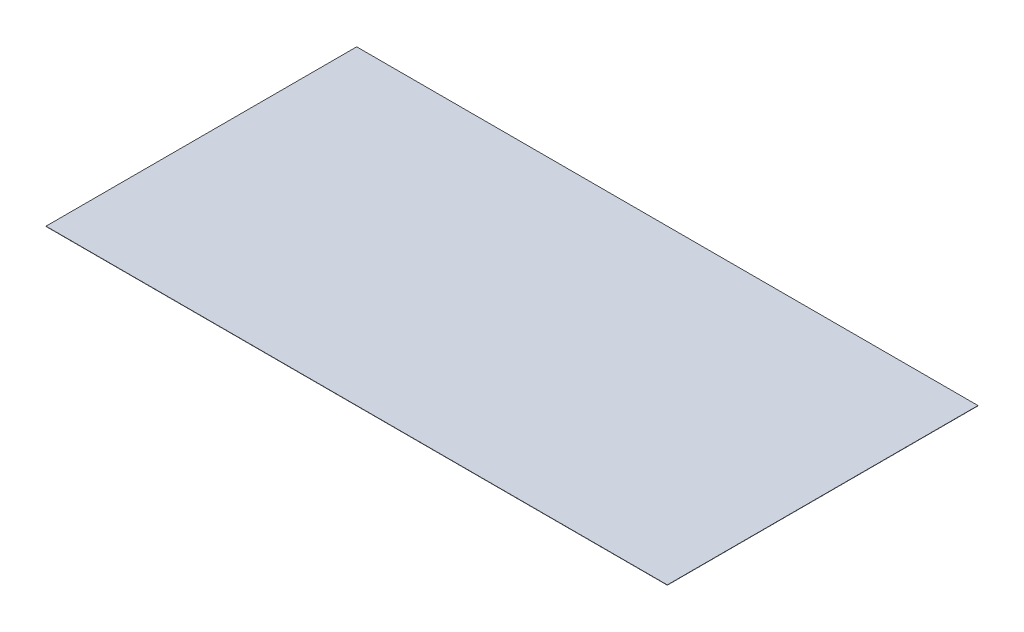
ISO-10303-21;
HEADER;
FILE_DESCRIPTION(('STEP AP214'),'2;1');
FILE_NAME('part.step','',(''),(''),'','','');
FILE_SCHEMA(('AUTOMOTIVE_DESIGN { 1 0 10303 214 1 1 1 1 }'));
ENDSEC;
DATA;
#1=APPLICATION_CONTEXT('core data for automotive mechanical design processes');
#2=APPLICATION_PROTOCOL_DEFINITION('international standard','automotive_design',2000,#1);
#3=PRODUCT_CONTEXT('',#1,'mechanical');
#4=PRODUCT('Part','Part','',(#3));
#5=PRODUCT_RELATED_PRODUCT_CATEGORY('part','',(#4));
#6=PRODUCT_DEFINITION_FORMATION('','',#4);
#7=PRODUCT_DEFINITION_CONTEXT('part definition',#1,'design');
#8=PRODUCT_DEFINITION('design','',#6,#7);
#9=PRODUCT_DEFINITION_SHAPE('','',#8);
#10=(LENGTH_UNIT() NAMED_UNIT(*) SI_UNIT(.MILLI.,.METRE.));
#11=(NAMED_UNIT(*) PLANE_ANGLE_UNIT() SI_UNIT($,.RADIAN.));
#12=(NAMED_UNIT(*) SI_UNIT($,.STERADIAN.) SOLID_ANGLE_UNIT());
#13=UNCERTAINTY_MEASURE_WITH_UNIT(LENGTH_MEASURE(1.E-05),#10,'distance_accuracy_value','');
#14=(GEOMETRIC_REPRESENTATION_CONTEXT(3) GLOBAL_UNCERTAINTY_ASSIGNED_CONTEXT((#13)) GLOBAL_UNIT_ASSIGNED_CONTEXT((#10,
#11,#12)) REPRESENTATION_CONTEXT('',''));
#15=CARTESIAN_POINT('',(0.,0.,0.));
#16=DIRECTION('',(0.,0.,1.));
#17=DIRECTION('',(1.,0.,0.));
#18=AXIS2_PLACEMENT_3D('',#15,#16,#17);
#19=CARTESIAN_POINT('',(0.,1.,0.));
#20=DIRECTION('',(1.,0.,0.));
#21=DIRECTION('',(0.,0.,-1.));
#22=AXIS2_PLACEMENT_3D('',#19,#20,#21);
#23=PLANE('',#22);
#24=DIRECTION('',(0.,0.,1.));
#25=VECTOR('',#24,1.);
#26=CARTESIAN_POINT('',(0.,0.,0.));
#27=LINE('',#26,#25);
#28=CARTESIAN_POINT('',(0.,0.,-1219.2));
#29=VERTEX_POINT('',#28);
#30=CARTESIAN_POINT('',(0.,0.,0.));
#31=VERTEX_POINT('',#30);
#32=EDGE_CURVE('E96',#29,#31,#27,.T.);
#33=ORIENTED_EDGE('',*,*,#32,.T.);
#34=DIRECTION('',(0.,-1.,0.));
#35=VECTOR('',#34,1.);
#36=CARTESIAN_POINT('',(0.,1.,0.));
#37=LINE('',#36,#35);
#38=CARTESIAN_POINT('',(0.,1.,0.));
#39=VERTEX_POINT('',#38);
#40=EDGE_CURVE('E11',#39,#31,#37,.T.);
#41=ORIENTED_EDGE('',*,*,#40,.F.);
#42=DIRECTION('',(0.,0.,1.));
#43=VECTOR('',#42,1.);
#44=CARTESIAN_POINT('',(0.,1.,0.));
#45=LINE('',#44,#43);
#46=CARTESIAN_POINT('',(0.,1.,-1219.2));
#47=VERTEX_POINT('',#46);
#48=EDGE_CURVE('E84',#47,#39,#45,.T.);
#49=ORIENTED_EDGE('',*,*,#48,.F.);
#50=DIRECTION('',(0.,-1.,0.));
#51=VECTOR('',#50,1.);
#52=CARTESIAN_POINT('',(0.,1.,-1219.2));
#53=LINE('',#52,#51);
#54=EDGE_CURVE('E92',#47,#29,#53,.T.);
#55=ORIENTED_EDGE('',*,*,#54,.T.);
#56=EDGE_LOOP('',(#33,#41,#49,#55));
#57=FACE_BOUND('',#56,.T.);
#58=ADVANCED_FACE('F33',(#57),#23,.F.);
#59=CARTESIAN_POINT('',(0.,1.,0.));
#60=DIRECTION('',(0.,0.,-1.));
#61=DIRECTION('',(-1.,0.,0.));
#62=AXIS2_PLACEMENT_3D('',#59,#60,#61);
#63=PLANE('',#62);
#64=DIRECTION('',(1.,0.,0.));
#65=VECTOR('',#64,1.);
#66=CARTESIAN_POINT('',(0.,0.,0.));
#67=LINE('',#66,#65);
#68=CARTESIAN_POINT('',(2438.4,0.,0.));
#69=VERTEX_POINT('',#68);
#70=EDGE_CURVE('E88',#31,#69,#67,.T.);
#71=ORIENTED_EDGE('',*,*,#70,.T.);
#72=DIRECTION('',(0.,-1.,0.));
#73=VECTOR('',#72,1.);
#74=CARTESIAN_POINT('',(2438.4,1.,0.));
#75=LINE('',#74,#73);
#76=CARTESIAN_POINT('',(2438.4,1.,0.));
#77=VERTEX_POINT('',#76);
#78=EDGE_CURVE('E41',#77,#69,#75,.T.);
#79=ORIENTED_EDGE('',*,*,#78,.F.);
#80=DIRECTION('',(1.,0.,0.));
#81=VECTOR('',#80,1.);
#82=CARTESIAN_POINT('',(0.,1.,0.));
#83=LINE('',#82,#81);
#84=EDGE_CURVE('E79',#39,#77,#83,.T.);
#85=ORIENTED_EDGE('',*,*,#84,.F.);
#86=ORIENTED_EDGE('',*,*,#40,.T.);
#87=EDGE_LOOP('',(#71,#79,#85,#86));
#88=FACE_BOUND('',#87,.T.);
#89=ADVANCED_FACE('F87',(#88),#63,.F.);
#90=CARTESIAN_POINT('',(2438.4,1.,0.));
#91=DIRECTION('',(-1.,0.,0.));
#92=DIRECTION('',(0.,0.,1.));
#93=AXIS2_PLACEMENT_3D('',#90,#91,#92);
#94=PLANE('',#93);
#95=DIRECTION('',(0.,0.,-1.));
#96=VECTOR('',#95,1.);
#97=CARTESIAN_POINT('',(2438.4,0.,0.));
#98=LINE('',#97,#96);
#99=CARTESIAN_POINT('',(2438.4,0.,-1219.2));
#100=VERTEX_POINT('',#99);
#101=EDGE_CURVE('E66',#69,#100,#98,.T.);
#102=ORIENTED_EDGE('',*,*,#101,.T.);
#103=DIRECTION('',(0.,-1.,0.));
#104=VECTOR('',#103,1.);
#105=CARTESIAN_POINT('',(2438.4,1.,-1219.2));
#106=LINE('',#105,#104);
#107=CARTESIAN_POINT('',(2438.4,1.,-1219.2));
#108=VERTEX_POINT('',#107);
#109=EDGE_CURVE('E89',#108,#100,#106,.T.);
#110=ORIENTED_EDGE('',*,*,#109,.F.);
#111=DIRECTION('',(0.,0.,-1.));
#112=VECTOR('',#111,1.);
#113=CARTESIAN_POINT('',(2438.4,1.,0.));
#114=LINE('',#113,#112);
#115=EDGE_CURVE('E82',#77,#108,#114,.T.);
#116=ORIENTED_EDGE('',*,*,#115,.F.);
#117=ORIENTED_EDGE('',*,*,#78,.T.);
#118=EDGE_LOOP('',(#102,#110,#116,#117));
#119=FACE_BOUND('',#118,.T.);
#120=ADVANCED_FACE('F90',(#119),#94,.F.);
#121=CARTESIAN_POINT('',(0.,1.,-1219.2));
#122=DIRECTION('',(0.,0.,1.));
#123=DIRECTION('',(1.,0.,0.));
#124=AXIS2_PLACEMENT_3D('',#121,#122,#123);
#125=PLANE('',#124);
#126=DIRECTION('',(-1.,0.,0.));
#127=VECTOR('',#126,1.);
#128=CARTESIAN_POINT('',(0.,0.,-1219.2));
#129=LINE('',#128,#127);
#130=EDGE_CURVE('E72',#100,#29,#129,.T.);
#131=ORIENTED_EDGE('',*,*,#130,.T.);
#132=ORIENTED_EDGE('',*,*,#54,.F.);
#133=DIRECTION('',(-1.,0.,0.));
#134=VECTOR('',#133,1.);
#135=CARTESIAN_POINT('',(0.,1.,-1219.2));
#136=LINE('',#135,#134);
#137=EDGE_CURVE('E49',#108,#47,#136,.T.);
#138=ORIENTED_EDGE('',*,*,#137,.F.);
#139=ORIENTED_EDGE('',*,*,#109,.T.);
#140=EDGE_LOOP('',(#131,#132,#138,#139));
#141=FACE_BOUND('',#140,.T.);
#142=ADVANCED_FACE('F103',(#141),#125,.F.);
#143=CARTESIAN_POINT('',(0.,1.,0.));
#144=DIRECTION('',(0.,-1.,0.));
#145=DIRECTION('',(0.,0.,-1.));
#146=AXIS2_PLACEMENT_3D('',#143,#144,#145);
#147=PLANE('',#146);
#148=ORIENTED_EDGE('',*,*,#48,.T.);
#149=ORIENTED_EDGE('',*,*,#84,.T.);
#150=ORIENTED_EDGE('',*,*,#115,.T.);
#151=ORIENTED_EDGE('',*,*,#137,.T.);
#152=EDGE_LOOP('',(#148,#149,#150,#151));
#153=FACE_BOUND('',#152,.T.);
#154=ADVANCED_FACE('F80',(#153),#147,.F.);
#155=CARTESIAN_POINT('',(0.,0.,0.));
#156=DIRECTION('',(0.,-1.,0.));
#157=DIRECTION('',(0.,0.,-1.));
#158=AXIS2_PLACEMENT_3D('',#155,#156,#157);
#159=PLANE('',#158);
#160=ORIENTED_EDGE('',*,*,#32,.F.);
#161=ORIENTED_EDGE('',*,*,#130,.F.);
#162=ORIENTED_EDGE('',*,*,#101,.F.);
#163=ORIENTED_EDGE('',*,*,#70,.F.);
#164=EDGE_LOOP('',(#160,#161,#162,#163));
#165=FACE_BOUND('',#164,.T.);
#166=ADVANCED_FACE('F106',(#165),#159,.T.);
#167=CLOSED_SHELL('',(#58,#89,#120,#142,#154,#166));
#168=MANIFOLD_SOLID_BREP('B2',#167);
#169=ADVANCED_BREP_SHAPE_REPRESENTATION('',(#18,#168),#14);
#170=SHAPE_DEFINITION_REPRESENTATION(#9,#169);
ENDSEC;
END-ISO-10303-21;
